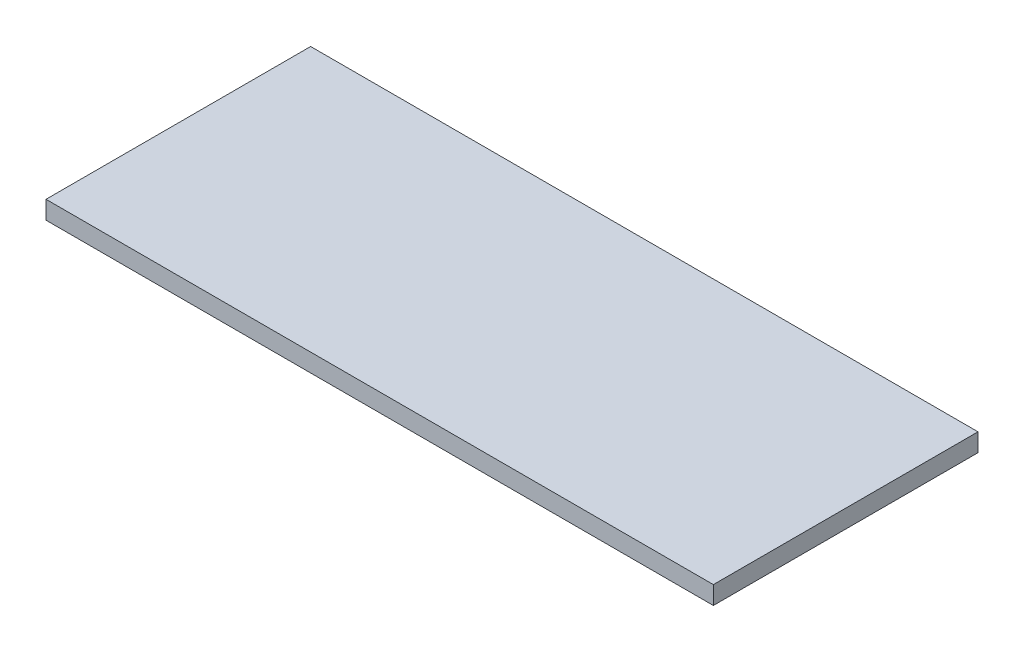
ISO-10303-21;
HEADER;
FILE_DESCRIPTION(('STEP AP214'),'2;1');
FILE_NAME('part.step','',(''),(''),'','','');
FILE_SCHEMA(('AUTOMOTIVE_DESIGN { 1 0 10303 214 1 1 1 1 }'));
ENDSEC;
DATA;
#1=APPLICATION_CONTEXT('core data for automotive mechanical design processes');
#2=APPLICATION_PROTOCOL_DEFINITION('international standard','automotive_design',2000,#1);
#3=PRODUCT_CONTEXT('',#1,'mechanical');
#4=PRODUCT('Part','Part','',(#3));
#5=PRODUCT_RELATED_PRODUCT_CATEGORY('part','',(#4));
#6=PRODUCT_DEFINITION_FORMATION('','',#4);
#7=PRODUCT_DEFINITION_CONTEXT('part definition',#1,'design');
#8=PRODUCT_DEFINITION('design','',#6,#7);
#9=PRODUCT_DEFINITION_SHAPE('','',#8);
#10=(LENGTH_UNIT() NAMED_UNIT(*) SI_UNIT(.MILLI.,.METRE.));
#11=(NAMED_UNIT(*) PLANE_ANGLE_UNIT() SI_UNIT($,.RADIAN.));
#12=(NAMED_UNIT(*) SI_UNIT($,.STERADIAN.) SOLID_ANGLE_UNIT());
#13=UNCERTAINTY_MEASURE_WITH_UNIT(LENGTH_MEASURE(1.E-05),#10,'distance_accuracy_value','');
#14=(GEOMETRIC_REPRESENTATION_CONTEXT(3) GLOBAL_UNCERTAINTY_ASSIGNED_CONTEXT((#13)) GLOBAL_UNIT_ASSIGNED_CONTEXT((#10,
#11,#12)) REPRESENTATION_CONTEXT('',''));
#15=CARTESIAN_POINT('',(0.,0.,0.));
#16=DIRECTION('',(0.,0.,1.));
#17=DIRECTION('',(1.,0.,0.));
#18=AXIS2_PLACEMENT_3D('',#15,#16,#17);
#19=CARTESIAN_POINT('',(0.,10.,0.));
#20=DIRECTION('',(1.,0.,0.));
#21=DIRECTION('',(0.,0.,-1.));
#22=AXIS2_PLACEMENT_3D('',#19,#20,#21);
#23=PLANE('',#22);
#24=DIRECTION('',(0.,0.,1.));
#25=VECTOR('',#24,1.);
#26=CARTESIAN_POINT('',(0.,0.,0.));
#27=LINE('',#26,#25);
#28=CARTESIAN_POINT('',(0.,0.,-146.05));
#29=VERTEX_POINT('',#28);
#30=CARTESIAN_POINT('',(0.,0.,0.));
#31=VERTEX_POINT('',#30);
#32=EDGE_CURVE('E111',#29,#31,#27,.T.);
#33=ORIENTED_EDGE('',*,*,#32,.T.);
#34=DIRECTION('',(0.,-1.,0.));
#35=VECTOR('',#34,1.);
#36=CARTESIAN_POINT('',(0.,10.,0.));
#37=LINE('',#36,#35);
#38=CARTESIAN_POINT('',(0.,10.,0.));
#39=VERTEX_POINT('',#38);
#40=EDGE_CURVE('E11',#39,#31,#37,.T.);
#41=ORIENTED_EDGE('',*,*,#40,.F.);
#42=DIRECTION('',(0.,0.,1.));
#43=VECTOR('',#42,1.);
#44=CARTESIAN_POINT('',(0.,10.,0.));
#45=LINE('',#44,#43);
#46=CARTESIAN_POINT('',(0.,10.,-146.05));
#47=VERTEX_POINT('',#46);
#48=EDGE_CURVE('E95',#47,#39,#45,.T.);
#49=ORIENTED_EDGE('',*,*,#48,.F.);
#50=DIRECTION('',(0.,-1.,0.));
#51=VECTOR('',#50,1.);
#52=CARTESIAN_POINT('',(0.,10.,-146.05));
#53=LINE('',#52,#51);
#54=EDGE_CURVE('E107',#47,#29,#53,.T.);
#55=ORIENTED_EDGE('',*,*,#54,.T.);
#56=EDGE_LOOP('',(#33,#41,#49,#55));
#57=FACE_BOUND('',#56,.T.);
#58=ADVANCED_FACE('F43',(#57),#23,.F.);
#59=CARTESIAN_POINT('',(0.,10.,0.));
#60=DIRECTION('',(0.,0.,-1.));
#61=DIRECTION('',(-1.,0.,0.));
#62=AXIS2_PLACEMENT_3D('',#59,#60,#61);
#63=PLANE('',#62);
#64=DIRECTION('',(1.,0.,0.));
#65=VECTOR('',#64,1.);
#66=CARTESIAN_POINT('',(0.,0.,0.));
#67=LINE('',#66,#65);
#68=CARTESIAN_POINT('',(368.3,0.,0.));
#69=VERTEX_POINT('',#68);
#70=EDGE_CURVE('E100',#31,#69,#67,.T.);
#71=ORIENTED_EDGE('',*,*,#70,.T.);
#72=DIRECTION('',(0.,-1.,0.));
#73=VECTOR('',#72,1.);
#74=CARTESIAN_POINT('',(368.3,10.,0.));
#75=LINE('',#74,#73);
#76=CARTESIAN_POINT('',(368.3,10.,0.));
#77=VERTEX_POINT('',#76);
#78=EDGE_CURVE('E52',#77,#69,#75,.T.);
#79=ORIENTED_EDGE('',*,*,#78,.F.);
#80=DIRECTION('',(1.,0.,0.));
#81=VECTOR('',#80,1.);
#82=CARTESIAN_POINT('',(0.,10.,0.));
#83=LINE('',#82,#81);
#84=EDGE_CURVE('E90',#39,#77,#83,.T.);
#85=ORIENTED_EDGE('',*,*,#84,.F.);
#86=ORIENTED_EDGE('',*,*,#40,.T.);
#87=EDGE_LOOP('',(#71,#79,#85,#86));
#88=FACE_BOUND('',#87,.T.);
#89=ADVANCED_FACE('F99',(#88),#63,.F.);
#90=CARTESIAN_POINT('',(368.3,10.,0.));
#91=DIRECTION('',(-1.,0.,0.));
#92=DIRECTION('',(0.,0.,1.));
#93=AXIS2_PLACEMENT_3D('',#90,#91,#92);
#94=PLANE('',#93);
#95=DIRECTION('',(0.,0.,-1.));
#96=VECTOR('',#95,1.);
#97=CARTESIAN_POINT('',(368.3,0.,0.));
#98=LINE('',#97,#96);
#99=CARTESIAN_POINT('',(368.3,0.,-146.05));
#100=VERTEX_POINT('',#99);
#101=EDGE_CURVE('E77',#69,#100,#98,.T.);
#102=ORIENTED_EDGE('',*,*,#101,.T.);
#103=DIRECTION('',(0.,-1.,0.));
#104=VECTOR('',#103,1.);
#105=CARTESIAN_POINT('',(368.3,10.,-146.05));
#106=LINE('',#105,#104);
#107=CARTESIAN_POINT('',(368.3,10.,-146.05));
#108=VERTEX_POINT('',#107);
#109=EDGE_CURVE('E102',#108,#100,#106,.T.);
#110=ORIENTED_EDGE('',*,*,#109,.F.);
#111=DIRECTION('',(0.,0.,-1.));
#112=VECTOR('',#111,1.);
#113=CARTESIAN_POINT('',(368.3,10.,0.));
#114=LINE('',#113,#112);
#115=EDGE_CURVE('E93',#77,#108,#114,.T.);
#116=ORIENTED_EDGE('',*,*,#115,.F.);
#117=ORIENTED_EDGE('',*,*,#78,.T.);
#118=EDGE_LOOP('',(#102,#110,#116,#117));
#119=FACE_BOUND('',#118,.T.);
#120=ADVANCED_FACE('F103',(#119),#94,.F.);
#121=CARTESIAN_POINT('',(0.,10.,-146.05));
#122=DIRECTION('',(0.,0.,1.));
#123=DIRECTION('',(1.,0.,0.));
#124=AXIS2_PLACEMENT_3D('',#121,#122,#123);
#125=PLANE('',#124);
#126=DIRECTION('',(-1.,0.,0.));
#127=VECTOR('',#126,1.);
#128=CARTESIAN_POINT('',(0.,0.,-146.05));
#129=LINE('',#128,#127);
#130=EDGE_CURVE('E83',#100,#29,#129,.T.);
#131=ORIENTED_EDGE('',*,*,#130,.T.);
#132=ORIENTED_EDGE('',*,*,#54,.F.);
#133=DIRECTION('',(-1.,0.,0.));
#134=VECTOR('',#133,1.);
#135=CARTESIAN_POINT('',(0.,10.,-146.05));
#136=LINE('',#135,#134);
#137=EDGE_CURVE('E60',#108,#47,#136,.T.);
#138=ORIENTED_EDGE('',*,*,#137,.F.);
#139=ORIENTED_EDGE('',*,*,#109,.T.);
#140=EDGE_LOOP('',(#131,#132,#138,#139));
#141=FACE_BOUND('',#140,.T.);
#142=ADVANCED_FACE('F124',(#141),#125,.F.);
#143=CARTESIAN_POINT('',(0.,10.,0.));
#144=DIRECTION('',(0.,-1.,0.));
#145=DIRECTION('',(0.,0.,-1.));
#146=AXIS2_PLACEMENT_3D('',#143,#144,#145);
#147=PLANE('',#146);
#148=ORIENTED_EDGE('',*,*,#48,.T.);
#149=ORIENTED_EDGE('',*,*,#84,.T.);
#150=ORIENTED_EDGE('',*,*,#115,.T.);
#151=ORIENTED_EDGE('',*,*,#137,.T.);
#152=EDGE_LOOP('',(#148,#149,#150,#151));
#153=FACE_BOUND('',#152,.T.);
#154=ADVANCED_FACE('F91',(#153),#147,.F.);
#155=CARTESIAN_POINT('',(0.,0.,0.));
#156=DIRECTION('',(0.,-1.,0.));
#157=DIRECTION('',(0.,0.,-1.));
#158=AXIS2_PLACEMENT_3D('',#155,#156,#157);
#159=PLANE('',#158);
#160=ORIENTED_EDGE('',*,*,#32,.F.);
#161=ORIENTED_EDGE('',*,*,#130,.F.);
#162=ORIENTED_EDGE('',*,*,#101,.F.);
#163=ORIENTED_EDGE('',*,*,#70,.F.);
#164=EDGE_LOOP('',(#160,#161,#162,#163));
#165=FACE_BOUND('',#164,.T.);
#166=ADVANCED_FACE('F127',(#165),#159,.T.);
#167=CLOSED_SHELL('',(#58,#89,#120,#142,#154,#166));
#168=MANIFOLD_SOLID_BREP('B2',#167);
#169=ADVANCED_BREP_SHAPE_REPRESENTATION('',(#18,#168),#14);
#170=SHAPE_DEFINITION_REPRESENTATION(#9,#169);
ENDSEC;
END-ISO-10303-21;
